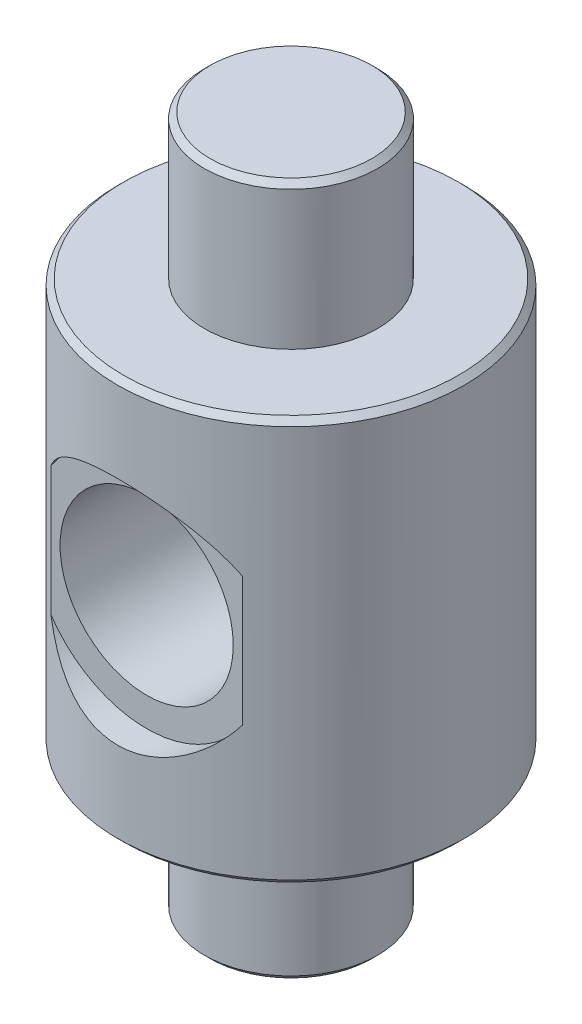
ISO-10303-21;
HEADER;
FILE_DESCRIPTION(('STEP AP214'),'2;1');
FILE_NAME('part.step','',(''),(''),'','','');
FILE_SCHEMA(('AUTOMOTIVE_DESIGN { 1 0 10303 214 1 1 1 1 }'));
ENDSEC;
DATA;
#1=APPLICATION_CONTEXT('core data for automotive mechanical design processes');
#2=APPLICATION_PROTOCOL_DEFINITION('international standard','automotive_design',2000,#1);
#3=PRODUCT_CONTEXT('',#1,'mechanical');
#4=PRODUCT('Part','Part','',(#3));
#5=PRODUCT_RELATED_PRODUCT_CATEGORY('part','',(#4));
#6=PRODUCT_DEFINITION_FORMATION('','',#4);
#7=PRODUCT_DEFINITION_CONTEXT('part definition',#1,'design');
#8=PRODUCT_DEFINITION('design','',#6,#7);
#9=PRODUCT_DEFINITION_SHAPE('','',#8);
#10=(LENGTH_UNIT() NAMED_UNIT(*) SI_UNIT(.MILLI.,.METRE.));
#11=(NAMED_UNIT(*) PLANE_ANGLE_UNIT() SI_UNIT($,.RADIAN.));
#12=(NAMED_UNIT(*) SI_UNIT($,.STERADIAN.) SOLID_ANGLE_UNIT());
#13=UNCERTAINTY_MEASURE_WITH_UNIT(LENGTH_MEASURE(1.E-05),#10,'distance_accuracy_value','');
#14=(GEOMETRIC_REPRESENTATION_CONTEXT(3) GLOBAL_UNCERTAINTY_ASSIGNED_CONTEXT((#13)) GLOBAL_UNIT_ASSIGNED_CONTEXT((#10,
#11,#12)) REPRESENTATION_CONTEXT('',''));
#15=CARTESIAN_POINT('',(0.,0.,0.));
#16=DIRECTION('',(0.,0.,1.));
#17=DIRECTION('',(1.,0.,0.));
#18=AXIS2_PLACEMENT_3D('',#15,#16,#17);
#19=CARTESIAN_POINT('',(0.,0.,0.));
#20=DIRECTION('',(0.,-1.,0.));
#21=DIRECTION('',(0.,0.,-1.));
#22=AXIS2_PLACEMENT_3D('',#19,#20,#21);
#23=CYLINDRICAL_SURFACE('',#22,3.);
#24=CARTESIAN_POINT('',(0.,2.6,0.));
#25=DIRECTION('',(0.,-1.,0.));
#26=DIRECTION('',(0.,0.,-1.));
#27=AXIS2_PLACEMENT_3D('',#24,#25,#26);
#28=CIRCLE('',#27,3.);
#29=CARTESIAN_POINT('',(0.,2.6,-3.));
#30=VERTEX_POINT('',#29);
#31=EDGE_CURVE('E115',#30,#30,#28,.F.);
#32=ORIENTED_EDGE('',*,*,#31,.T.);
#33=EDGE_LOOP('',(#32));
#34=FACE_BOUND('',#33,.T.);
#35=CARTESIAN_POINT('',(0.,9.4,0.));
#36=DIRECTION('',(0.,1.,0.));
#37=DIRECTION('',(0.,0.,1.));
#38=AXIS2_PLACEMENT_3D('',#35,#36,#37);
#39=CIRCLE('',#38,3.);
#40=CARTESIAN_POINT('',(0.,9.4,3.));
#41=VERTEX_POINT('',#40);
#42=EDGE_CURVE('E112',#41,#41,#39,.F.);
#43=ORIENTED_EDGE('',*,*,#42,.T.);
#44=EDGE_LOOP('',(#43));
#45=FACE_BOUND('',#44,.T.);
#46=CARTESIAN_POINT('',(-1.6583123951777,4.88196601125011,2.5));
#47=CARTESIAN_POINT('',(-1.62588041682893,4.83388174951264,2.52151479876285));
#48=CARTESIAN_POINT('',(-1.59147775995563,4.78734838879081,2.54342347636609));
#49=CARTESIAN_POINT('',(-1.51881718972826,4.69748455207734,2.5874697531549));
#50=CARTESIAN_POINT('',(-1.48055809930373,4.65415506101724,2.60960742037181));
#51=CARTESIAN_POINT('',(-1.35957897250648,4.52856680233055,2.67582114663101));
#52=CARTESIAN_POINT('',(-1.27112677213644,4.45140473959464,2.71937159504119));
#53=CARTESIAN_POINT('',(-1.08001742837921,4.31252958225246,2.80078430015006));
#54=CARTESIAN_POINT('',(-0.977318184431943,4.25086385700159,2.83862897767655));
#55=CARTESIAN_POINT('',(-0.760170773384896,4.14620224628185,2.90429124381123));
#56=CARTESIAN_POINT('',(-0.645766459364156,4.103139618855,2.93214461594087));
#57=CARTESIAN_POINT('',(-0.42245729889637,4.04211006134393,2.97201413865436));
#58=CARTESIAN_POINT('',(-0.314455876194935,4.02181009129021,2.98549347454722));
#59=CARTESIAN_POINT('',(-0.0957318708440063,3.99927723884014,3.00046894125686));
#60=CARTESIAN_POINT('',(0.0149896939065672,3.99703769834788,3.00196948813079));
#61=CARTESIAN_POINT('',(0.219788899237258,4.00983152656241,2.99345292695804));
#62=CARTESIAN_POINT('',(0.314087916632492,4.02256428894883,2.98496974119453));
#63=CARTESIAN_POINT('',(0.498831374402182,4.06091145766797,2.95970537418975));
#64=CARTESIAN_POINT('',(0.589276397828324,4.08652390793745,2.94292545299631));
#65=CARTESIAN_POINT('',(0.766037685544138,4.15008299698925,2.90199776264025));
#66=CARTESIAN_POINT('',(0.852235141290288,4.18826615536471,2.87770930064207));
#67=CARTESIAN_POINT('',(1.01715798189846,4.27544067615506,2.8236387306717));
#68=CARTESIAN_POINT('',(1.09587569901238,4.32444296225357,2.79385107537834));
#69=CARTESIAN_POINT('',(1.25565427239454,4.43974414257662,2.72615287516341));
#70=CARTESIAN_POINT('',(1.33541158103129,4.50751898370635,2.68769051048631));
#71=CARTESIAN_POINT('',(1.48295801527083,4.65403199592482,2.60917581519461));
#72=CARTESIAN_POINT('',(1.55076586541565,4.73275266247985,2.56912609477701));
#73=CARTESIAN_POINT('',(1.62799531219028,4.83795848005763,2.51991822969558));
#74=CARTESIAN_POINT('',(1.64336841165434,4.85980271753446,2.5099145043454));
#75=CARTESIAN_POINT('',(1.6583123951777,4.88196601125011,2.5));
#76=B_SPLINE_CURVE_WITH_KNOTS('',3,(#46,#47,#48,#49,#50,#51,#52,#53,#54,#55,#56,#57,#58,#59,#60,
#61,#62,#63,#64,#65,#66,#67,#68,#69,#70,#71,#72,#73,#74,#75),.UNSPECIFIED.,.F.,.F.,(4,2,2,2,2,2,
2,2,2,2,2,2,2,2,4),(0.,0.185463815245249,0.370984410633051,0.744697847347586,1.1195401269487,
1.49302619268151,1.82315350216072,2.1531591024743,2.43842427846838,2.72364614376402,
3.01457448418865,3.30579791879389,3.6390815214847,3.97183814013364,4.05738621739483),.UNSPECIFIED.);
#77=CARTESIAN_POINT('',(-1.6583123951777,4.88196601125011,2.5));
#78=VERTEX_POINT('',#77);
#79=CARTESIAN_POINT('',(1.6583123951777,4.88196601125011,2.5));
#80=VERTEX_POINT('',#79);
#81=EDGE_CURVE('E165',#78,#80,#76,.T.);
#82=ORIENTED_EDGE('',*,*,#81,.F.);
#83=DIRECTION('',(0.,-1.,0.));
#84=VECTOR('',#83,1.);
#85=CARTESIAN_POINT('',(-1.6583123951777,0.,2.5));
#86=LINE('',#85,#84);
#87=CARTESIAN_POINT('',(-1.6583123951777,7.11803398874989,2.5));
#88=VERTEX_POINT('',#87);
#89=EDGE_CURVE('E178',#78,#88,#86,.F.);
#90=ORIENTED_EDGE('',*,*,#89,.T.);
#91=CARTESIAN_POINT('',(1.6583123951777,7.11803398874989,2.5));
#92=CARTESIAN_POINT('',(1.62588041682893,7.16611825048736,2.52151479876285));
#93=CARTESIAN_POINT('',(1.59147775995563,7.21265161120919,2.54342347636609));
#94=CARTESIAN_POINT('',(1.51881718972826,7.30251544792266,2.5874697531549));
#95=CARTESIAN_POINT('',(1.48055809930373,7.34584493898276,2.60960742037181));
#96=CARTESIAN_POINT('',(1.35957897250648,7.47143319766945,2.67582114663101));
#97=CARTESIAN_POINT('',(1.27112677213644,7.54859526040536,2.71937159504119));
#98=CARTESIAN_POINT('',(1.08001742837921,7.68747041774754,2.80078430015006));
#99=CARTESIAN_POINT('',(0.977318184431943,7.74913614299841,2.83862897767655));
#100=CARTESIAN_POINT('',(0.760170773384897,7.85379775371815,2.90429124381123));
#101=CARTESIAN_POINT('',(0.645766459364157,7.896860381145,2.93214461594087));
#102=CARTESIAN_POINT('',(0.422457298896371,7.95788993865607,2.97201413865436));
#103=CARTESIAN_POINT('',(0.314455876194935,7.97818990870978,2.98549347454722));
#104=CARTESIAN_POINT('',(0.0957318708440068,8.00072276115986,3.00046894125686));
#105=CARTESIAN_POINT('',(-0.0149896939065668,8.00296230165212,3.00196948813079));
#106=CARTESIAN_POINT('',(-0.219788899237258,7.9901684734376,2.99345292695804));
#107=CARTESIAN_POINT('',(-0.314087916632492,7.97743571105117,2.98496974119453));
#108=CARTESIAN_POINT('',(-0.498831374402183,7.93908854233203,2.95970537418975));
#109=CARTESIAN_POINT('',(-0.589276397828325,7.91347609206255,2.94292545299631));
#110=CARTESIAN_POINT('',(-0.766037685544138,7.84991700301075,2.90199776264025));
#111=CARTESIAN_POINT('',(-0.852235141290288,7.81173384463529,2.87770930064207));
#112=CARTESIAN_POINT('',(-1.01715798189846,7.72455932384494,2.8236387306717));
#113=CARTESIAN_POINT('',(-1.09587569901238,7.67555703774643,2.79385107537834));
#114=CARTESIAN_POINT('',(-1.25565427239454,7.56025585742338,2.72615287516341));
#115=CARTESIAN_POINT('',(-1.33541158103129,7.49248101629365,2.68769051048631));
#116=CARTESIAN_POINT('',(-1.48295801527083,7.34596800407518,2.60917581519461));
#117=CARTESIAN_POINT('',(-1.55076586541565,7.26724733752015,2.56912609477701));
#118=CARTESIAN_POINT('',(-1.62799531219028,7.16204151994237,2.51991822969558));
#119=CARTESIAN_POINT('',(-1.64336841165434,7.14019728246554,2.5099145043454));
#120=CARTESIAN_POINT('',(-1.6583123951777,7.11803398874989,2.5));
#121=B_SPLINE_CURVE_WITH_KNOTS('',3,(#91,#92,#93,#94,#95,#96,#97,#98,#99,#100,#101,#102,#103,
#104,#105,#106,#107,#108,#109,#110,#111,#112,#113,#114,#115,#116,#117,#118,#119,#120),
.UNSPECIFIED.,.F.,.F.,(4,2,2,2,2,2,2,2,2,2,2,2,2,2,4),(0.,0.185463815245249,0.370984410633051,
0.744697847347586,1.1195401269487,1.49302619268151,1.82315350216072,2.1531591024743,
2.43842427846838,2.72364614376402,3.01457448418865,3.30579791879389,3.6390815214847,
3.97183814013364,4.05738621739483),.UNSPECIFIED.);
#122=CARTESIAN_POINT('',(1.6583123951777,7.11803398874989,2.5));
#123=VERTEX_POINT('',#122);
#124=EDGE_CURVE('E156',#123,#88,#121,.T.);
#125=ORIENTED_EDGE('',*,*,#124,.F.);
#126=DIRECTION('',(0.,-1.,0.));
#127=VECTOR('',#126,1.);
#128=CARTESIAN_POINT('',(1.6583123951777,0.,2.5));
#129=LINE('',#128,#127);
#130=EDGE_CURVE('E342',#123,#80,#129,.T.);
#131=ORIENTED_EDGE('',*,*,#130,.T.);
#132=EDGE_LOOP('',(#82,#90,#125,#131));
#133=FACE_BOUND('',#132,.T.);
#134=DIRECTION('',(0.,-1.,0.));
#135=VECTOR('',#134,1.);
#136=CARTESIAN_POINT('',(1.6583123951777,0.,-2.5));
#137=LINE('',#136,#135);
#138=CARTESIAN_POINT('',(1.6583123951777,4.88196601125011,-2.5));
#139=VERTEX_POINT('',#138);
#140=CARTESIAN_POINT('',(1.6583123951777,7.11803398874989,-2.5));
#141=VERTEX_POINT('',#140);
#142=EDGE_CURVE('E93',#139,#141,#137,.F.);
#143=ORIENTED_EDGE('',*,*,#142,.T.);
#144=CARTESIAN_POINT('',(1.6583123951777,7.11803398874989,-2.5));
#145=CARTESIAN_POINT('',(1.62588041682893,7.16611825048736,-2.52151479876285));
#146=CARTESIAN_POINT('',(1.59147775995563,7.21265161120919,-2.54342347636609));
#147=CARTESIAN_POINT('',(1.51881718972826,7.30251544792266,-2.5874697531549));
#148=CARTESIAN_POINT('',(1.48055809930373,7.34584493898276,-2.60960742037181));
#149=CARTESIAN_POINT('',(1.35957897250648,7.47143319766945,-2.67582114663101));
#150=CARTESIAN_POINT('',(1.27112677213644,7.54859526040536,-2.71937159504119));
#151=CARTESIAN_POINT('',(1.08001742837921,7.68747041774754,-2.80078430015006));
#152=CARTESIAN_POINT('',(0.977318184431943,7.74913614299841,-2.83862897767655));
#153=CARTESIAN_POINT('',(0.760170773384897,7.85379775371815,-2.90429124381123));
#154=CARTESIAN_POINT('',(0.645766459364157,7.896860381145,-2.93214461594087));
#155=CARTESIAN_POINT('',(0.422457298896371,7.95788993865607,-2.97201413865436));
#156=CARTESIAN_POINT('',(0.314455876194935,7.97818990870978,-2.98549347454722));
#157=CARTESIAN_POINT('',(0.0957318708440068,8.00072276115986,-3.00046894125686));
#158=CARTESIAN_POINT('',(-0.0149896939065668,8.00296230165212,-3.00196948813079));
#159=CARTESIAN_POINT('',(-0.219788899237258,7.9901684734376,-2.99345292695804));
#160=CARTESIAN_POINT('',(-0.314087916632492,7.97743571105117,-2.98496974119453));
#161=CARTESIAN_POINT('',(-0.498831374402183,7.93908854233203,-2.95970537418975));
#162=CARTESIAN_POINT('',(-0.589276397828325,7.91347609206255,-2.94292545299631));
#163=CARTESIAN_POINT('',(-0.766037685544138,7.84991700301075,-2.90199776264025));
#164=CARTESIAN_POINT('',(-0.852235141290288,7.81173384463529,-2.87770930064207));
#165=CARTESIAN_POINT('',(-1.01715798189846,7.72455932384494,-2.8236387306717));
#166=CARTESIAN_POINT('',(-1.09587569901238,7.67555703774643,-2.79385107537834));
#167=CARTESIAN_POINT('',(-1.25565427239454,7.56025585742338,-2.72615287516341));
#168=CARTESIAN_POINT('',(-1.33541158103129,7.49248101629365,-2.68769051048631));
#169=CARTESIAN_POINT('',(-1.48295801527083,7.34596800407518,-2.60917581519461));
#170=CARTESIAN_POINT('',(-1.55076586541565,7.26724733752015,-2.56912609477701));
#171=CARTESIAN_POINT('',(-1.62799531219028,7.16204151994237,-2.51991822969558));
#172=CARTESIAN_POINT('',(-1.64336841165434,7.14019728246554,-2.5099145043454));
#173=CARTESIAN_POINT('',(-1.6583123951777,7.11803398874989,-2.5));
#174=B_SPLINE_CURVE_WITH_KNOTS('',3,(#144,#145,#146,#147,#148,#149,#150,#151,#152,#153,#154,
#155,#156,#157,#158,#159,#160,#161,#162,#163,#164,#165,#166,#167,#168,#169,#170,#171,#172,#173),
.UNSPECIFIED.,.F.,.F.,(4,2,2,2,2,2,2,2,2,2,2,2,2,2,4),(0.,0.185463815245249,0.370984410633051,
0.744697847347586,1.1195401269487,1.49302619268151,1.82315350216072,2.1531591024743,
2.43842427846838,2.72364614376402,3.01457448418865,3.30579791879389,3.6390815214847,
3.97183814013364,4.05738621739483),.UNSPECIFIED.);
#175=CARTESIAN_POINT('',(-1.6583123951777,7.11803398874989,-2.5));
#176=VERTEX_POINT('',#175);
#177=EDGE_CURVE('E82',#141,#176,#174,.T.);
#178=ORIENTED_EDGE('',*,*,#177,.T.);
#179=DIRECTION('',(0.,-1.,0.));
#180=VECTOR('',#179,1.);
#181=CARTESIAN_POINT('',(-1.6583123951777,0.,-2.5));
#182=LINE('',#181,#180);
#183=CARTESIAN_POINT('',(-1.6583123951777,4.88196601125011,-2.5));
#184=VERTEX_POINT('',#183);
#185=EDGE_CURVE('E89',#176,#184,#182,.T.);
#186=ORIENTED_EDGE('',*,*,#185,.T.);
#187=CARTESIAN_POINT('',(-1.6583123951777,4.88196601125011,-2.5));
#188=CARTESIAN_POINT('',(-1.62588041682893,4.83388174951264,-2.52151479876285));
#189=CARTESIAN_POINT('',(-1.59147775995563,4.78734838879081,-2.54342347636609));
#190=CARTESIAN_POINT('',(-1.51881718972826,4.69748455207734,-2.5874697531549));
#191=CARTESIAN_POINT('',(-1.48055809930373,4.65415506101724,-2.60960742037181));
#192=CARTESIAN_POINT('',(-1.35957897250648,4.52856680233055,-2.67582114663101));
#193=CARTESIAN_POINT('',(-1.27112677213644,4.45140473959464,-2.71937159504119));
#194=CARTESIAN_POINT('',(-1.08001742837921,4.31252958225246,-2.80078430015006));
#195=CARTESIAN_POINT('',(-0.977318184431943,4.25086385700159,-2.83862897767655));
#196=CARTESIAN_POINT('',(-0.760170773384896,4.14620224628185,-2.90429124381123));
#197=CARTESIAN_POINT('',(-0.645766459364156,4.103139618855,-2.93214461594087));
#198=CARTESIAN_POINT('',(-0.42245729889637,4.04211006134393,-2.97201413865436));
#199=CARTESIAN_POINT('',(-0.314455876194935,4.02181009129021,-2.98549347454722));
#200=CARTESIAN_POINT('',(-0.0957318708440063,3.99927723884014,-3.00046894125686));
#201=CARTESIAN_POINT('',(0.0149896939065672,3.99703769834788,-3.00196948813079));
#202=CARTESIAN_POINT('',(0.219788899237258,4.00983152656241,-2.99345292695804));
#203=CARTESIAN_POINT('',(0.314087916632492,4.02256428894883,-2.98496974119453));
#204=CARTESIAN_POINT('',(0.498831374402182,4.06091145766797,-2.95970537418975));
#205=CARTESIAN_POINT('',(0.589276397828324,4.08652390793745,-2.94292545299631));
#206=CARTESIAN_POINT('',(0.766037685544138,4.15008299698925,-2.90199776264025));
#207=CARTESIAN_POINT('',(0.852235141290288,4.18826615536471,-2.87770930064207));
#208=CARTESIAN_POINT('',(1.01715798189846,4.27544067615506,-2.8236387306717));
#209=CARTESIAN_POINT('',(1.09587569901238,4.32444296225357,-2.79385107537834));
#210=CARTESIAN_POINT('',(1.25565427239454,4.43974414257662,-2.72615287516341));
#211=CARTESIAN_POINT('',(1.33541158103129,4.50751898370635,-2.68769051048631));
#212=CARTESIAN_POINT('',(1.48295801527083,4.65403199592482,-2.60917581519461));
#213=CARTESIAN_POINT('',(1.55076586541565,4.73275266247985,-2.56912609477701));
#214=CARTESIAN_POINT('',(1.62799531219028,4.83795848005763,-2.51991822969558));
#215=CARTESIAN_POINT('',(1.64336841165434,4.85980271753446,-2.5099145043454));
#216=CARTESIAN_POINT('',(1.6583123951777,4.88196601125011,-2.5));
#217=B_SPLINE_CURVE_WITH_KNOTS('',3,(#187,#188,#189,#190,#191,#192,#193,#194,#195,#196,#197,
#198,#199,#200,#201,#202,#203,#204,#205,#206,#207,#208,#209,#210,#211,#212,#213,#214,#215,#216),
.UNSPECIFIED.,.F.,.F.,(4,2,2,2,2,2,2,2,2,2,2,2,2,2,4),(0.,0.185463815245249,0.370984410633051,
0.744697847347586,1.1195401269487,1.49302619268151,1.82315350216072,2.1531591024743,
2.43842427846838,2.72364614376402,3.01457448418865,3.30579791879389,3.6390815214847,
3.97183814013364,4.05738621739483),.UNSPECIFIED.);
#218=EDGE_CURVE('E52',#184,#139,#217,.T.);
#219=ORIENTED_EDGE('',*,*,#218,.T.);
#220=EDGE_LOOP('',(#143,#178,#186,#219));
#221=FACE_BOUND('',#220,.T.);
#222=ADVANCED_FACE('F37',(#34,#45,#133,#221),#23,.T.);
#223=CARTESIAN_POINT('',(1.5,0.,0.));
#224=DIRECTION('',(0.,-1.,0.));
#225=DIRECTION('',(0.,0.,-1.));
#226=AXIS2_PLACEMENT_3D('',#223,#224,#225);
#227=PLANE('',#226);
#228=CARTESIAN_POINT('',(0.,0.,0.));
#229=DIRECTION('',(0.,-1.,0.));
#230=DIRECTION('',(0.,0.,-1.));
#231=AXIS2_PLACEMENT_3D('',#228,#229,#230);
#232=CIRCLE('',#231,1.4);
#233=CARTESIAN_POINT('',(0.,0.,-1.4));
#234=VERTEX_POINT('',#233);
#235=EDGE_CURVE('E96',#234,#234,#232,.T.);
#236=ORIENTED_EDGE('',*,*,#235,.T.);
#237=EDGE_LOOP('',(#236));
#238=FACE_BOUND('',#237,.T.);
#239=ADVANCED_FACE('F136',(#238),#227,.T.);
#240=CARTESIAN_POINT('',(0.,12.,0.));
#241=DIRECTION('',(0.,1.,0.));
#242=DIRECTION('',(0.,0.,1.));
#243=AXIS2_PLACEMENT_3D('',#240,#241,#242);
#244=PLANE('',#243);
#245=CARTESIAN_POINT('',(0.,12.,0.));
#246=DIRECTION('',(0.,1.,0.));
#247=DIRECTION('',(0.,0.,1.));
#248=AXIS2_PLACEMENT_3D('',#245,#246,#247);
#249=CIRCLE('',#248,1.4);
#250=CARTESIAN_POINT('',(0.,12.,1.4));
#251=VERTEX_POINT('',#250);
#252=EDGE_CURVE('E11',#251,#251,#249,.T.);
#253=ORIENTED_EDGE('',*,*,#252,.T.);
#254=EDGE_LOOP('',(#253));
#255=FACE_BOUND('',#254,.T.);
#256=ADVANCED_FACE('F142',(#255),#244,.T.);
#257=CARTESIAN_POINT('',(0.,0.,0.));
#258=DIRECTION('',(0.,-1.,0.));
#259=DIRECTION('',(0.,0.,-1.));
#260=AXIS2_PLACEMENT_3D('',#257,#258,#259);
#261=CYLINDRICAL_SURFACE('',#260,1.5);
#262=CARTESIAN_POINT('',(0.,11.9,0.));
#263=DIRECTION('',(0.,1.,0.));
#264=DIRECTION('',(0.,0.,1.));
#265=AXIS2_PLACEMENT_3D('',#262,#263,#264);
#266=CIRCLE('',#265,1.5);
#267=CARTESIAN_POINT('',(0.,11.9,1.5));
#268=VERTEX_POINT('',#267);
#269=EDGE_CURVE('E46',#268,#268,#266,.F.);
#270=ORIENTED_EDGE('',*,*,#269,.T.);
#271=EDGE_LOOP('',(#270));
#272=FACE_BOUND('',#271,.T.);
#273=CARTESIAN_POINT('',(0.,9.5,0.));
#274=DIRECTION('',(0.,-1.,0.));
#275=DIRECTION('',(0.,0.,-1.));
#276=AXIS2_PLACEMENT_3D('',#273,#274,#275);
#277=CIRCLE('',#276,1.5);
#278=CARTESIAN_POINT('',(0.,9.5,-1.5));
#279=VERTEX_POINT('',#278);
#280=EDGE_CURVE('E214',#279,#279,#277,.T.);
#281=ORIENTED_EDGE('',*,*,#280,.F.);
#282=EDGE_LOOP('',(#281));
#283=FACE_BOUND('',#282,.T.);
#284=ADVANCED_FACE('F123',(#272,#283),#261,.T.);
#285=CARTESIAN_POINT('',(1.5,9.5,0.));
#286=DIRECTION('',(0.,1.,0.));
#287=DIRECTION('',(0.,0.,1.));
#288=AXIS2_PLACEMENT_3D('',#285,#286,#287);
#289=PLANE('',#288);
#290=CARTESIAN_POINT('',(0.,9.5,0.));
#291=DIRECTION('',(0.,1.,0.));
#292=DIRECTION('',(0.,0.,1.));
#293=AXIS2_PLACEMENT_3D('',#290,#291,#292);
#294=CIRCLE('',#293,2.9);
#295=CARTESIAN_POINT('',(0.,9.5,2.9));
#296=VERTEX_POINT('',#295);
#297=EDGE_CURVE('E118',#296,#296,#294,.T.);
#298=ORIENTED_EDGE('',*,*,#297,.T.);
#299=EDGE_LOOP('',(#298));
#300=FACE_BOUND('',#299,.T.);
#301=ORIENTED_EDGE('',*,*,#280,.T.);
#302=EDGE_LOOP('',(#301));
#303=FACE_BOUND('',#302,.T.);
#304=ADVANCED_FACE('F151',(#300,#303),#289,.T.);
#305=CARTESIAN_POINT('',(3.,2.5,0.));
#306=DIRECTION('',(0.,-1.,0.));
#307=DIRECTION('',(0.,0.,-1.));
#308=AXIS2_PLACEMENT_3D('',#305,#306,#307);
#309=PLANE('',#308);
#310=CARTESIAN_POINT('',(0.,2.5,0.));
#311=DIRECTION('',(0.,-1.,0.));
#312=DIRECTION('',(0.,0.,-1.));
#313=AXIS2_PLACEMENT_3D('',#310,#311,#312);
#314=CIRCLE('',#313,2.9);
#315=CARTESIAN_POINT('',(0.,2.5,-2.9));
#316=VERTEX_POINT('',#315);
#317=EDGE_CURVE('E109',#316,#316,#314,.T.);
#318=ORIENTED_EDGE('',*,*,#317,.T.);
#319=EDGE_LOOP('',(#318));
#320=FACE_BOUND('',#319,.T.);
#321=CARTESIAN_POINT('',(0.,2.5,0.));
#322=DIRECTION('',(0.,-1.,0.));
#323=DIRECTION('',(0.,0.,-1.));
#324=AXIS2_PLACEMENT_3D('',#321,#322,#323);
#325=CIRCLE('',#324,1.5);
#326=CARTESIAN_POINT('',(0.,2.5,-1.5));
#327=VERTEX_POINT('',#326);
#328=EDGE_CURVE('E212',#327,#327,#325,.T.);
#329=ORIENTED_EDGE('',*,*,#328,.F.);
#330=EDGE_LOOP('',(#329));
#331=FACE_BOUND('',#330,.T.);
#332=ADVANCED_FACE('F149',(#320,#331),#309,.T.);
#333=CARTESIAN_POINT('',(0.,0.,0.));
#334=DIRECTION('',(0.,-1.,0.));
#335=DIRECTION('',(0.,0.,-1.));
#336=AXIS2_PLACEMENT_3D('',#333,#334,#335);
#337=CYLINDRICAL_SURFACE('',#336,1.5);
#338=CARTESIAN_POINT('',(0.,0.0999999999999974,0.));
#339=DIRECTION('',(0.,-1.,0.));
#340=DIRECTION('',(0.,0.,-1.));
#341=AXIS2_PLACEMENT_3D('',#338,#339,#340);
#342=CIRCLE('',#341,1.5);
#343=CARTESIAN_POINT('',(0.,0.0999999999999974,-1.5));
#344=VERTEX_POINT('',#343);
#345=EDGE_CURVE('E99',#344,#344,#342,.F.);
#346=ORIENTED_EDGE('',*,*,#345,.T.);
#347=EDGE_LOOP('',(#346));
#348=FACE_BOUND('',#347,.T.);
#349=ORIENTED_EDGE('',*,*,#328,.T.);
#350=EDGE_LOOP('',(#349));
#351=FACE_BOUND('',#350,.T.);
#352=ADVANCED_FACE('F198',(#348,#351),#337,.T.);
#353=CARTESIAN_POINT('',(0.,6.,2.5));
#354=DIRECTION('',(0.,0.,1.));
#355=DIRECTION('',(1.,0.,0.));
#356=AXIS2_PLACEMENT_3D('',#353,#354,#355);
#357=CYLINDRICAL_SURFACE('',#356,2.);
#358=CARTESIAN_POINT('',(0.,6.,2.5));
#359=DIRECTION('',(0.,0.,1.));
#360=DIRECTION('',(1.,0.,0.));
#361=AXIS2_PLACEMENT_3D('',#358,#359,#360);
#362=CIRCLE('',#361,2.);
#363=EDGE_CURVE('E60',#78,#80,#362,.T.);
#364=ORIENTED_EDGE('',*,*,#363,.F.);
#365=ORIENTED_EDGE('',*,*,#81,.T.);
#366=EDGE_LOOP('',(#364,#365));
#367=FACE_BOUND('',#366,.T.);
#368=ADVANCED_FACE('F196',(#367),#357,.F.);
#369=EDGE_CURVE('E215',#123,#88,#362,.T.);
#370=ORIENTED_EDGE('',*,*,#369,.F.);
#371=ORIENTED_EDGE('',*,*,#124,.T.);
#372=EDGE_LOOP('',(#370,#371));
#373=FACE_BOUND('',#372,.T.);
#374=ADVANCED_FACE('F192',(#373),#357,.F.);
#375=CARTESIAN_POINT('',(0.,6.,2.5));
#376=DIRECTION('',(0.,0.,1.));
#377=DIRECTION('',(1.,0.,0.));
#378=AXIS2_PLACEMENT_3D('',#375,#376,#377);
#379=PLANE('',#378);
#380=CARTESIAN_POINT('',(0.,6.,2.5));
#381=DIRECTION('',(0.,0.,1.));
#382=DIRECTION('',(1.,0.,0.));
#383=AXIS2_PLACEMENT_3D('',#380,#381,#382);
#384=CIRCLE('',#383,1.5);
#385=CARTESIAN_POINT('',(1.5,6.,2.5));
#386=VERTEX_POINT('',#385);
#387=EDGE_CURVE('E105',#386,#386,#384,.T.);
#388=ORIENTED_EDGE('',*,*,#387,.F.);
#389=EDGE_LOOP('',(#388));
#390=FACE_BOUND('',#389,.T.);
#391=ORIENTED_EDGE('',*,*,#363,.T.);
#392=ORIENTED_EDGE('',*,*,#130,.F.);
#393=ORIENTED_EDGE('',*,*,#369,.T.);
#394=ORIENTED_EDGE('',*,*,#89,.F.);
#395=EDGE_LOOP('',(#391,#392,#393,#394));
#396=FACE_BOUND('',#395,.T.);
#397=ADVANCED_FACE('F189',(#390,#396),#379,.T.);
#398=CARTESIAN_POINT('',(0.,6.,-2.5));
#399=DIRECTION('',(0.,0.,-1.));
#400=DIRECTION('',(-1.,0.,0.));
#401=AXIS2_PLACEMENT_3D('',#398,#399,#400);
#402=CYLINDRICAL_SURFACE('',#401,2.);
#403=CARTESIAN_POINT('',(0.,6.,-2.5));
#404=DIRECTION('',(0.,0.,1.));
#405=DIRECTION('',(1.,0.,0.));
#406=AXIS2_PLACEMENT_3D('',#403,#404,#405);
#407=CIRCLE('',#406,2.);
#408=EDGE_CURVE('E85',#141,#176,#407,.T.);
#409=ORIENTED_EDGE('',*,*,#408,.T.);
#410=ORIENTED_EDGE('',*,*,#177,.F.);
#411=EDGE_LOOP('',(#409,#410));
#412=FACE_BOUND('',#411,.T.);
#413=ADVANCED_FACE('F84',(#412),#402,.F.);
#414=EDGE_CURVE('E94',#184,#139,#407,.T.);
#415=ORIENTED_EDGE('',*,*,#414,.T.);
#416=ORIENTED_EDGE('',*,*,#218,.F.);
#417=EDGE_LOOP('',(#415,#416));
#418=FACE_BOUND('',#417,.T.);
#419=ADVANCED_FACE('F183',(#418),#402,.F.);
#420=CARTESIAN_POINT('',(0.,6.,-2.5));
#421=DIRECTION('',(0.,0.,-1.));
#422=DIRECTION('',(1.,0.,0.));
#423=AXIS2_PLACEMENT_3D('',#420,#421,#422);
#424=PLANE('',#423);
#425=CARTESIAN_POINT('',(0.,6.,-2.5));
#426=DIRECTION('',(0.,0.,-1.));
#427=DIRECTION('',(-1.,0.,0.));
#428=AXIS2_PLACEMENT_3D('',#425,#426,#427);
#429=CIRCLE('',#428,1.5);
#430=CARTESIAN_POINT('',(-1.5,6.,-2.5));
#431=VERTEX_POINT('',#430);
#432=EDGE_CURVE('E103',#431,#431,#429,.T.);
#433=ORIENTED_EDGE('',*,*,#432,.F.);
#434=EDGE_LOOP('',(#433));
#435=FACE_BOUND('',#434,.T.);
#436=ORIENTED_EDGE('',*,*,#414,.F.);
#437=ORIENTED_EDGE('',*,*,#185,.F.);
#438=ORIENTED_EDGE('',*,*,#408,.F.);
#439=ORIENTED_EDGE('',*,*,#142,.F.);
#440=EDGE_LOOP('',(#436,#437,#438,#439));
#441=FACE_BOUND('',#440,.T.);
#442=ADVANCED_FACE('F92',(#435,#441),#424,.T.);
#443=CARTESIAN_POINT('',(0.,6.,-3.));
#444=DIRECTION('',(0.,0.,1.));
#445=DIRECTION('',(1.,0.,0.));
#446=AXIS2_PLACEMENT_3D('',#443,#444,#445);
#447=CYLINDRICAL_SURFACE('',#446,1.5);
#448=ORIENTED_EDGE('',*,*,#432,.T.);
#449=EDGE_LOOP('',(#448));
#450=FACE_BOUND('',#449,.T.);
#451=ORIENTED_EDGE('',*,*,#387,.T.);
#452=EDGE_LOOP('',(#451));
#453=FACE_BOUND('',#452,.T.);
#454=ADVANCED_FACE('F224',(#450,#453),#447,.F.);
#455=CARTESIAN_POINT('',(0.,0.,0.));
#456=DIRECTION('',(0.,1.,0.));
#457=DIRECTION('',(0.,0.,1.));
#458=AXIS2_PLACEMENT_3D('',#455,#456,#457);
#459=CONICAL_SURFACE('',#458,1.4,0.785398163397452);
#460=ORIENTED_EDGE('',*,*,#345,.F.);
#461=EDGE_LOOP('',(#460));
#462=FACE_BOUND('',#461,.T.);
#463=ORIENTED_EDGE('',*,*,#235,.F.);
#464=EDGE_LOOP('',(#463));
#465=FACE_BOUND('',#464,.T.);
#466=ADVANCED_FACE('F226',(#462,#465),#459,.T.);
#467=CARTESIAN_POINT('',(0.,2.5,0.));
#468=DIRECTION('',(0.,1.,0.));
#469=DIRECTION('',(0.,0.,1.));
#470=AXIS2_PLACEMENT_3D('',#467,#468,#469);
#471=CONICAL_SURFACE('',#470,2.9,0.785398163397446);
#472=ORIENTED_EDGE('',*,*,#31,.F.);
#473=EDGE_LOOP('',(#472));
#474=FACE_BOUND('',#473,.T.);
#475=ORIENTED_EDGE('',*,*,#317,.F.);
#476=EDGE_LOOP('',(#475));
#477=FACE_BOUND('',#476,.T.);
#478=ADVANCED_FACE('F132',(#474,#477),#471,.T.);
#479=CARTESIAN_POINT('',(0.,9.4,0.));
#480=DIRECTION('',(0.,-1.,0.));
#481=DIRECTION('',(0.,0.,-1.));
#482=AXIS2_PLACEMENT_3D('',#479,#480,#481);
#483=CONICAL_SURFACE('',#482,3.,0.785398163397448);
#484=ORIENTED_EDGE('',*,*,#297,.F.);
#485=EDGE_LOOP('',(#484));
#486=FACE_BOUND('',#485,.T.);
#487=ORIENTED_EDGE('',*,*,#42,.F.);
#488=EDGE_LOOP('',(#487));
#489=FACE_BOUND('',#488,.T.);
#490=ADVANCED_FACE('F127',(#486,#489),#483,.T.);
#491=CARTESIAN_POINT('',(0.,11.9,0.));
#492=DIRECTION('',(0.,-1.,0.));
#493=DIRECTION('',(0.,0.,-1.));
#494=AXIS2_PLACEMENT_3D('',#491,#492,#493);
#495=CONICAL_SURFACE('',#494,1.5,0.785398163397452);
#496=ORIENTED_EDGE('',*,*,#252,.F.);
#497=EDGE_LOOP('',(#496));
#498=FACE_BOUND('',#497,.T.);
#499=ORIENTED_EDGE('',*,*,#269,.F.);
#500=EDGE_LOOP('',(#499));
#501=FACE_BOUND('',#500,.T.);
#502=ADVANCED_FACE('F40',(#498,#501),#495,.T.);
#503=CLOSED_SHELL('',(#222,#239,#256,#284,#304,#332,#352,#368,#374,#397,#413,#419,#442,#454,
#466,#478,#490,#502));
#504=MANIFOLD_SOLID_BREP('B2',#503);
#505=ADVANCED_BREP_SHAPE_REPRESENTATION('',(#18,#504),#14);
#506=SHAPE_DEFINITION_REPRESENTATION(#9,#505);
ENDSEC;
END-ISO-10303-21;
